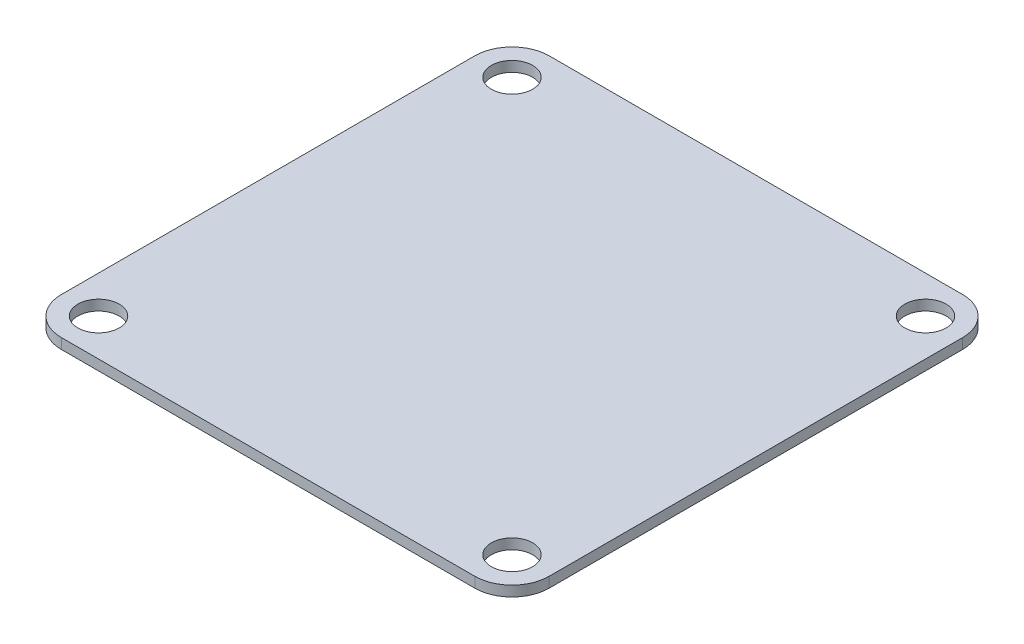
ISO-10303-21;
HEADER;
FILE_DESCRIPTION(('STEP AP214'),'2;1');
FILE_NAME('part.step','',(''),(''),'','','');
FILE_SCHEMA(('AUTOMOTIVE_DESIGN { 1 0 10303 214 1 1 1 1 }'));
ENDSEC;
DATA;
#1=APPLICATION_CONTEXT('core data for automotive mechanical design processes');
#2=APPLICATION_PROTOCOL_DEFINITION('international standard','automotive_design',2000,#1);
#3=PRODUCT_CONTEXT('',#1,'mechanical');
#4=PRODUCT('Part','Part','',(#3));
#5=PRODUCT_RELATED_PRODUCT_CATEGORY('part','',(#4));
#6=PRODUCT_DEFINITION_FORMATION('','',#4);
#7=PRODUCT_DEFINITION_CONTEXT('part definition',#1,'design');
#8=PRODUCT_DEFINITION('design','',#6,#7);
#9=PRODUCT_DEFINITION_SHAPE('','',#8);
#10=(LENGTH_UNIT() NAMED_UNIT(*) SI_UNIT(.MILLI.,.METRE.));
#11=(NAMED_UNIT(*) PLANE_ANGLE_UNIT() SI_UNIT($,.RADIAN.));
#12=(NAMED_UNIT(*) SI_UNIT($,.STERADIAN.) SOLID_ANGLE_UNIT());
#13=UNCERTAINTY_MEASURE_WITH_UNIT(LENGTH_MEASURE(1.E-05),#10,'distance_accuracy_value','');
#14=(GEOMETRIC_REPRESENTATION_CONTEXT(3) GLOBAL_UNCERTAINTY_ASSIGNED_CONTEXT((#13)) GLOBAL_UNIT_ASSIGNED_CONTEXT((#10,
#11,#12)) REPRESENTATION_CONTEXT('',''));
#15=CARTESIAN_POINT('',(0.,0.,0.));
#16=DIRECTION('',(0.,0.,1.));
#17=DIRECTION('',(1.,0.,0.));
#18=AXIS2_PLACEMENT_3D('',#15,#16,#17);
#19=CARTESIAN_POINT('',(-99.9999999999941,5.,-99.9999999999964));
#20=DIRECTION('',(0.,1.,0.));
#21=DIRECTION('',(0.,0.,1.));
#22=AXIS2_PLACEMENT_3D('',#19,#20,#21);
#23=PLANE('',#22);
#24=CARTESIAN_POINT('',(-99.9999999999905,5.,99.9999999999976));
#25=DIRECTION('',(0.,1.,0.));
#26=DIRECTION('',(0.,0.,1.));
#27=AXIS2_PLACEMENT_3D('',#24,#25,#26);
#28=CIRCLE('',#27,10.0000000000102);
#29=CARTESIAN_POINT('',(-99.9999999999905,5.,110.000000000008));
#30=VERTEX_POINT('',#29);
#31=EDGE_CURVE('E188',#30,#30,#28,.T.);
#32=ORIENTED_EDGE('',*,*,#31,.F.);
#33=EDGE_LOOP('',(#32));
#34=FACE_BOUND('',#33,.T.);
#35=CARTESIAN_POINT('',(100.,5.,-100.));
#36=DIRECTION('',(0.,1.,0.));
#37=DIRECTION('',(0.,0.,1.));
#38=AXIS2_PLACEMENT_3D('',#35,#36,#37);
#39=CIRCLE('',#38,9.99999999999999);
#40=CARTESIAN_POINT('',(100.,5.,-90.));
#41=VERTEX_POINT('',#40);
#42=EDGE_CURVE('E134',#41,#41,#39,.T.);
#43=ORIENTED_EDGE('',*,*,#42,.F.);
#44=EDGE_LOOP('',(#43));
#45=FACE_BOUND('',#44,.T.);
#46=CARTESIAN_POINT('',(-99.9999999999941,5.,-99.9999999999964));
#47=DIRECTION('',(0.,1.,0.));
#48=DIRECTION('',(0.,0.,1.));
#49=AXIS2_PLACEMENT_3D('',#46,#47,#48);
#50=CIRCLE('',#49,18.);
#51=CARTESIAN_POINT('',(-99.9999999999941,5.,-117.999999999996));
#52=VERTEX_POINT('',#51);
#53=CARTESIAN_POINT('',(-117.999999999994,5.,-99.9999999999964));
#54=VERTEX_POINT('',#53);
#55=EDGE_CURVE('E145',#52,#54,#50,.T.);
#56=ORIENTED_EDGE('',*,*,#55,.T.);
#57=DIRECTION('',(0.,0.,1.));
#58=VECTOR('',#57,1.);
#59=CARTESIAN_POINT('',(-117.999999999994,5.,99.9999999999983));
#60=LINE('',#59,#58);
#61=CARTESIAN_POINT('',(-117.999999999994,5.,99.9999999999983));
#62=VERTEX_POINT('',#61);
#63=EDGE_CURVE('E93',#54,#62,#60,.T.);
#64=ORIENTED_EDGE('',*,*,#63,.T.);
#65=CARTESIAN_POINT('',(-99.999999999994,5.,99.9999999999983));
#66=DIRECTION('',(0.,1.,0.));
#67=DIRECTION('',(0.,0.,1.));
#68=AXIS2_PLACEMENT_3D('',#65,#66,#67);
#69=CIRCLE('',#68,18.);
#70=CARTESIAN_POINT('',(-99.9999999999941,5.,117.999999999998));
#71=VERTEX_POINT('',#70);
#72=EDGE_CURVE('E160',#62,#71,#69,.T.);
#73=ORIENTED_EDGE('',*,*,#72,.T.);
#74=DIRECTION('',(1.,0.,0.));
#75=VECTOR('',#74,1.);
#76=CARTESIAN_POINT('',(100.000000000001,5.,117.999999999998));
#77=LINE('',#76,#75);
#78=CARTESIAN_POINT('',(100.000000000001,5.,117.999999999998));
#79=VERTEX_POINT('',#78);
#80=EDGE_CURVE('E173',#71,#79,#77,.T.);
#81=ORIENTED_EDGE('',*,*,#80,.T.);
#82=CARTESIAN_POINT('',(100.000000000001,5.,99.9999999999983));
#83=DIRECTION('',(0.,1.,0.));
#84=DIRECTION('',(0.,0.,1.));
#85=AXIS2_PLACEMENT_3D('',#82,#83,#84);
#86=CIRCLE('',#85,18.);
#87=CARTESIAN_POINT('',(118.000000000001,5.,99.9999999999983));
#88=VERTEX_POINT('',#87);
#89=EDGE_CURVE('E112',#79,#88,#86,.T.);
#90=ORIENTED_EDGE('',*,*,#89,.T.);
#91=DIRECTION('',(0.,0.,-1.));
#92=VECTOR('',#91,1.);
#93=CARTESIAN_POINT('',(118.000000000001,5.,-99.9999999999964));
#94=LINE('',#93,#92);
#95=CARTESIAN_POINT('',(118.000000000001,5.,-99.9999999999964));
#96=VERTEX_POINT('',#95);
#97=EDGE_CURVE('E106',#88,#96,#94,.T.);
#98=ORIENTED_EDGE('',*,*,#97,.T.);
#99=CARTESIAN_POINT('',(100.000000000001,5.,-99.9999999999964));
#100=DIRECTION('',(0.,1.,0.));
#101=DIRECTION('',(0.,0.,1.));
#102=AXIS2_PLACEMENT_3D('',#99,#100,#101);
#103=CIRCLE('',#102,18.);
#104=CARTESIAN_POINT('',(100.000000000001,5.,-117.999999999996));
#105=VERTEX_POINT('',#104);
#106=EDGE_CURVE('E110',#96,#105,#103,.T.);
#107=ORIENTED_EDGE('',*,*,#106,.T.);
#108=DIRECTION('',(-1.,0.,0.));
#109=VECTOR('',#108,1.);
#110=CARTESIAN_POINT('',(-99.9999999999941,5.,-117.999999999996));
#111=LINE('',#110,#109);
#112=EDGE_CURVE('E50',#105,#52,#111,.T.);
#113=ORIENTED_EDGE('',*,*,#112,.T.);
#114=EDGE_LOOP('',(#56,#64,#73,#81,#90,#98,#107,#113));
#115=FACE_BOUND('',#114,.T.);
#116=CARTESIAN_POINT('',(100.000000000004,5.,99.999999999994));
#117=DIRECTION('',(0.,1.,0.));
#118=DIRECTION('',(0.,0.,1.));
#119=AXIS2_PLACEMENT_3D('',#116,#117,#118);
#120=CIRCLE('',#119,10.0000000000049);
#121=CARTESIAN_POINT('',(100.000000000004,5.,109.999999999999));
#122=VERTEX_POINT('',#121);
#123=EDGE_CURVE('E182',#122,#122,#120,.T.);
#124=ORIENTED_EDGE('',*,*,#123,.F.);
#125=EDGE_LOOP('',(#124));
#126=FACE_BOUND('',#125,.T.);
#127=CARTESIAN_POINT('',(-99.9999999999941,5.,-99.9999999999964));
#128=DIRECTION('',(0.,1.,0.));
#129=DIRECTION('',(0.,0.,1.));
#130=AXIS2_PLACEMENT_3D('',#127,#128,#129);
#131=CIRCLE('',#130,10.0000000000058);
#132=CARTESIAN_POINT('',(-99.9999999999941,5.,-89.9999999999906));
#133=VERTEX_POINT('',#132);
#134=EDGE_CURVE('E194',#133,#133,#131,.T.);
#135=ORIENTED_EDGE('',*,*,#134,.F.);
#136=EDGE_LOOP('',(#135));
#137=FACE_BOUND('',#136,.T.);
#138=ADVANCED_FACE('F33',(#34,#45,#115,#126,#137),#23,.T.);
#139=CARTESIAN_POINT('',(-99.9999999999941,0.,-99.9999999999964));
#140=DIRECTION('',(0.,1.,0.));
#141=DIRECTION('',(0.,0.,1.));
#142=AXIS2_PLACEMENT_3D('',#139,#140,#141);
#143=PLANE('',#142);
#144=CARTESIAN_POINT('',(-99.9999999999941,0.,-99.9999999999964));
#145=DIRECTION('',(0.,1.,0.));
#146=DIRECTION('',(0.,0.,1.));
#147=AXIS2_PLACEMENT_3D('',#144,#145,#146);
#148=CIRCLE('',#147,18.);
#149=CARTESIAN_POINT('',(-99.9999999999941,0.,-117.999999999996));
#150=VERTEX_POINT('',#149);
#151=CARTESIAN_POINT('',(-117.999999999994,0.,-99.9999999999964));
#152=VERTEX_POINT('',#151);
#153=EDGE_CURVE('E130',#150,#152,#148,.T.);
#154=ORIENTED_EDGE('',*,*,#153,.F.);
#155=DIRECTION('',(-1.,0.,0.));
#156=VECTOR('',#155,1.);
#157=CARTESIAN_POINT('',(-99.9999999999941,0.,-117.999999999996));
#158=LINE('',#157,#156);
#159=CARTESIAN_POINT('',(100.000000000001,0.,-117.999999999996));
#160=VERTEX_POINT('',#159);
#161=EDGE_CURVE('E85',#160,#150,#158,.T.);
#162=ORIENTED_EDGE('',*,*,#161,.F.);
#163=CARTESIAN_POINT('',(100.000000000001,0.,-99.9999999999964));
#164=DIRECTION('',(0.,1.,0.));
#165=DIRECTION('',(0.,0.,1.));
#166=AXIS2_PLACEMENT_3D('',#163,#164,#165);
#167=CIRCLE('',#166,18.);
#168=CARTESIAN_POINT('',(118.000000000001,0.,-99.9999999999964));
#169=VERTEX_POINT('',#168);
#170=EDGE_CURVE('E79',#169,#160,#167,.T.);
#171=ORIENTED_EDGE('',*,*,#170,.F.);
#172=DIRECTION('',(0.,0.,-1.));
#173=VECTOR('',#172,1.);
#174=CARTESIAN_POINT('',(118.000000000001,0.,-99.9999999999964));
#175=LINE('',#174,#173);
#176=CARTESIAN_POINT('',(118.000000000001,0.,99.9999999999983));
#177=VERTEX_POINT('',#176);
#178=EDGE_CURVE('E120',#177,#169,#175,.T.);
#179=ORIENTED_EDGE('',*,*,#178,.F.);
#180=CARTESIAN_POINT('',(100.000000000001,0.,99.9999999999983));
#181=DIRECTION('',(0.,1.,0.));
#182=DIRECTION('',(0.,0.,1.));
#183=AXIS2_PLACEMENT_3D('',#180,#181,#182);
#184=CIRCLE('',#183,18.);
#185=CARTESIAN_POINT('',(100.000000000001,0.,117.999999999998));
#186=VERTEX_POINT('',#185);
#187=EDGE_CURVE('E140',#186,#177,#184,.T.);
#188=ORIENTED_EDGE('',*,*,#187,.F.);
#189=DIRECTION('',(1.,0.,0.));
#190=VECTOR('',#189,1.);
#191=CARTESIAN_POINT('',(100.000000000001,0.,117.999999999998));
#192=LINE('',#191,#190);
#193=CARTESIAN_POINT('',(-99.9999999999941,0.,117.999999999998));
#194=VERTEX_POINT('',#193);
#195=EDGE_CURVE('E138',#194,#186,#192,.T.);
#196=ORIENTED_EDGE('',*,*,#195,.F.);
#197=CARTESIAN_POINT('',(-99.999999999994,0.,99.9999999999983));
#198=DIRECTION('',(0.,1.,0.));
#199=DIRECTION('',(0.,0.,1.));
#200=AXIS2_PLACEMENT_3D('',#197,#198,#199);
#201=CIRCLE('',#200,18.);
#202=CARTESIAN_POINT('',(-117.999999999994,0.,99.9999999999983));
#203=VERTEX_POINT('',#202);
#204=EDGE_CURVE('E136',#203,#194,#201,.T.);
#205=ORIENTED_EDGE('',*,*,#204,.F.);
#206=DIRECTION('',(0.,0.,1.));
#207=VECTOR('',#206,1.);
#208=CARTESIAN_POINT('',(-117.999999999994,0.,99.9999999999983));
#209=LINE('',#208,#207);
#210=EDGE_CURVE('E133',#152,#203,#209,.T.);
#211=ORIENTED_EDGE('',*,*,#210,.F.);
#212=EDGE_LOOP('',(#154,#162,#171,#179,#188,#196,#205,#211));
#213=FACE_BOUND('',#212,.T.);
#214=CARTESIAN_POINT('',(100.,0.,-100.));
#215=DIRECTION('',(0.,1.,0.));
#216=DIRECTION('',(0.,0.,1.));
#217=AXIS2_PLACEMENT_3D('',#214,#215,#216);
#218=CIRCLE('',#217,9.99999999999999);
#219=CARTESIAN_POINT('',(100.,0.,-90.));
#220=VERTEX_POINT('',#219);
#221=EDGE_CURVE('E179',#220,#220,#218,.T.);
#222=ORIENTED_EDGE('',*,*,#221,.T.);
#223=EDGE_LOOP('',(#222));
#224=FACE_BOUND('',#223,.T.);
#225=CARTESIAN_POINT('',(100.000000000004,0.,99.999999999994));
#226=DIRECTION('',(0.,1.,0.));
#227=DIRECTION('',(0.,0.,1.));
#228=AXIS2_PLACEMENT_3D('',#225,#226,#227);
#229=CIRCLE('',#228,10.0000000000049);
#230=CARTESIAN_POINT('',(100.000000000004,0.,109.999999999999));
#231=VERTEX_POINT('',#230);
#232=EDGE_CURVE('E185',#231,#231,#229,.T.);
#233=ORIENTED_EDGE('',*,*,#232,.T.);
#234=EDGE_LOOP('',(#233));
#235=FACE_BOUND('',#234,.T.);
#236=CARTESIAN_POINT('',(-99.9999999999905,0.,99.9999999999976));
#237=DIRECTION('',(0.,1.,0.));
#238=DIRECTION('',(0.,0.,1.));
#239=AXIS2_PLACEMENT_3D('',#236,#237,#238);
#240=CIRCLE('',#239,10.0000000000102);
#241=CARTESIAN_POINT('',(-99.9999999999905,0.,110.000000000008));
#242=VERTEX_POINT('',#241);
#243=EDGE_CURVE('E191',#242,#242,#240,.T.);
#244=ORIENTED_EDGE('',*,*,#243,.T.);
#245=EDGE_LOOP('',(#244));
#246=FACE_BOUND('',#245,.T.);
#247=CARTESIAN_POINT('',(-99.9999999999941,0.,-99.9999999999964));
#248=DIRECTION('',(0.,1.,0.));
#249=DIRECTION('',(0.,0.,1.));
#250=AXIS2_PLACEMENT_3D('',#247,#248,#249);
#251=CIRCLE('',#250,10.0000000000058);
#252=CARTESIAN_POINT('',(-99.9999999999941,0.,-89.9999999999906));
#253=VERTEX_POINT('',#252);
#254=EDGE_CURVE('E197',#253,#253,#251,.T.);
#255=ORIENTED_EDGE('',*,*,#254,.T.);
#256=EDGE_LOOP('',(#255));
#257=FACE_BOUND('',#256,.T.);
#258=ADVANCED_FACE('F164',(#213,#224,#235,#246,#257),#143,.F.);
#259=CARTESIAN_POINT('',(-99.9999999999941,5.,-99.9999999999964));
#260=DIRECTION('',(0.,-1.,0.));
#261=DIRECTION('',(0.,0.,-1.));
#262=AXIS2_PLACEMENT_3D('',#259,#260,#261);
#263=CYLINDRICAL_SURFACE('',#262,18.);
#264=ORIENTED_EDGE('',*,*,#153,.T.);
#265=DIRECTION('',(0.,-1.,0.));
#266=VECTOR('',#265,1.);
#267=CARTESIAN_POINT('',(-117.999999999994,5.,-99.9999999999964));
#268=LINE('',#267,#266);
#269=EDGE_CURVE('E11',#54,#152,#268,.T.);
#270=ORIENTED_EDGE('',*,*,#269,.F.);
#271=ORIENTED_EDGE('',*,*,#55,.F.);
#272=DIRECTION('',(0.,-1.,0.));
#273=VECTOR('',#272,1.);
#274=CARTESIAN_POINT('',(-99.9999999999941,5.,-117.999999999996));
#275=LINE('',#274,#273);
#276=EDGE_CURVE('E126',#52,#150,#275,.T.);
#277=ORIENTED_EDGE('',*,*,#276,.T.);
#278=EDGE_LOOP('',(#264,#270,#271,#277));
#279=FACE_BOUND('',#278,.T.);
#280=ADVANCED_FACE('F35',(#279),#263,.T.);
#281=CARTESIAN_POINT('',(-117.999999999994,5.,99.9999999999983));
#282=DIRECTION('',(1.,0.,0.));
#283=DIRECTION('',(0.,0.,-1.));
#284=AXIS2_PLACEMENT_3D('',#281,#282,#283);
#285=PLANE('',#284);
#286=ORIENTED_EDGE('',*,*,#210,.T.);
#287=DIRECTION('',(0.,-1.,0.));
#288=VECTOR('',#287,1.);
#289=CARTESIAN_POINT('',(-117.999999999994,5.,99.9999999999983));
#290=LINE('',#289,#288);
#291=EDGE_CURVE('E42',#62,#203,#290,.T.);
#292=ORIENTED_EDGE('',*,*,#291,.F.);
#293=ORIENTED_EDGE('',*,*,#63,.F.);
#294=ORIENTED_EDGE('',*,*,#269,.T.);
#295=EDGE_LOOP('',(#286,#292,#293,#294));
#296=FACE_BOUND('',#295,.T.);
#297=ADVANCED_FACE('F231',(#296),#285,.F.);
#298=CARTESIAN_POINT('',(-99.999999999994,5.,99.9999999999983));
#299=DIRECTION('',(0.,-1.,0.));
#300=DIRECTION('',(0.,0.,-1.));
#301=AXIS2_PLACEMENT_3D('',#298,#299,#300);
#302=CYLINDRICAL_SURFACE('',#301,18.);
#303=ORIENTED_EDGE('',*,*,#204,.T.);
#304=DIRECTION('',(0.,-1.,0.));
#305=VECTOR('',#304,1.);
#306=CARTESIAN_POINT('',(-99.9999999999941,5.,117.999999999998));
#307=LINE('',#306,#305);
#308=EDGE_CURVE('E152',#71,#194,#307,.T.);
#309=ORIENTED_EDGE('',*,*,#308,.F.);
#310=ORIENTED_EDGE('',*,*,#72,.F.);
#311=ORIENTED_EDGE('',*,*,#291,.T.);
#312=EDGE_LOOP('',(#303,#309,#310,#311));
#313=FACE_BOUND('',#312,.T.);
#314=ADVANCED_FACE('F158',(#313),#302,.T.);
#315=CARTESIAN_POINT('',(100.000000000001,5.,117.999999999998));
#316=DIRECTION('',(0.,0.,-1.));
#317=DIRECTION('',(-1.,0.,0.));
#318=AXIS2_PLACEMENT_3D('',#315,#316,#317);
#319=PLANE('',#318);
#320=ORIENTED_EDGE('',*,*,#195,.T.);
#321=DIRECTION('',(0.,-1.,0.));
#322=VECTOR('',#321,1.);
#323=CARTESIAN_POINT('',(100.000000000001,5.,117.999999999998));
#324=LINE('',#323,#322);
#325=EDGE_CURVE('E149',#79,#186,#324,.T.);
#326=ORIENTED_EDGE('',*,*,#325,.F.);
#327=ORIENTED_EDGE('',*,*,#80,.F.);
#328=ORIENTED_EDGE('',*,*,#308,.T.);
#329=EDGE_LOOP('',(#320,#326,#327,#328));
#330=FACE_BOUND('',#329,.T.);
#331=ADVANCED_FACE('F169',(#330),#319,.F.);
#332=CARTESIAN_POINT('',(100.000000000001,5.,99.9999999999983));
#333=DIRECTION('',(0.,-1.,0.));
#334=DIRECTION('',(0.,0.,-1.));
#335=AXIS2_PLACEMENT_3D('',#332,#333,#334);
#336=CYLINDRICAL_SURFACE('',#335,18.);
#337=ORIENTED_EDGE('',*,*,#187,.T.);
#338=DIRECTION('',(0.,-1.,0.));
#339=VECTOR('',#338,1.);
#340=CARTESIAN_POINT('',(118.000000000001,5.,99.9999999999983));
#341=LINE('',#340,#339);
#342=EDGE_CURVE('E121',#88,#177,#341,.T.);
#343=ORIENTED_EDGE('',*,*,#342,.F.);
#344=ORIENTED_EDGE('',*,*,#89,.F.);
#345=ORIENTED_EDGE('',*,*,#325,.T.);
#346=EDGE_LOOP('',(#337,#343,#344,#345));
#347=FACE_BOUND('',#346,.T.);
#348=ADVANCED_FACE('F172',(#347),#336,.T.);
#349=CARTESIAN_POINT('',(118.000000000001,5.,-99.9999999999964));
#350=DIRECTION('',(-1.,0.,0.));
#351=DIRECTION('',(0.,0.,1.));
#352=AXIS2_PLACEMENT_3D('',#349,#350,#351);
#353=PLANE('',#352);
#354=ORIENTED_EDGE('',*,*,#178,.T.);
#355=DIRECTION('',(0.,-1.,0.));
#356=VECTOR('',#355,1.);
#357=CARTESIAN_POINT('',(118.000000000001,5.,-99.9999999999964));
#358=LINE('',#357,#356);
#359=EDGE_CURVE('E117',#96,#169,#358,.T.);
#360=ORIENTED_EDGE('',*,*,#359,.F.);
#361=ORIENTED_EDGE('',*,*,#97,.F.);
#362=ORIENTED_EDGE('',*,*,#342,.T.);
#363=EDGE_LOOP('',(#354,#360,#361,#362));
#364=FACE_BOUND('',#363,.T.);
#365=ADVANCED_FACE('F118',(#364),#353,.F.);
#366=CARTESIAN_POINT('',(100.000000000001,5.,-99.9999999999964));
#367=DIRECTION('',(0.,-1.,0.));
#368=DIRECTION('',(0.,0.,-1.));
#369=AXIS2_PLACEMENT_3D('',#366,#367,#368);
#370=CYLINDRICAL_SURFACE('',#369,18.);
#371=ORIENTED_EDGE('',*,*,#170,.T.);
#372=DIRECTION('',(0.,-1.,0.));
#373=VECTOR('',#372,1.);
#374=CARTESIAN_POINT('',(100.000000000001,5.,-117.999999999996));
#375=LINE('',#374,#373);
#376=EDGE_CURVE('E122',#105,#160,#375,.T.);
#377=ORIENTED_EDGE('',*,*,#376,.F.);
#378=ORIENTED_EDGE('',*,*,#106,.F.);
#379=ORIENTED_EDGE('',*,*,#359,.T.);
#380=EDGE_LOOP('',(#371,#377,#378,#379));
#381=FACE_BOUND('',#380,.T.);
#382=ADVANCED_FACE('F124',(#381),#370,.T.);
#383=CARTESIAN_POINT('',(-99.9999999999941,5.,-117.999999999996));
#384=DIRECTION('',(0.,0.,1.));
#385=DIRECTION('',(1.,0.,0.));
#386=AXIS2_PLACEMENT_3D('',#383,#384,#385);
#387=PLANE('',#386);
#388=ORIENTED_EDGE('',*,*,#161,.T.);
#389=ORIENTED_EDGE('',*,*,#276,.F.);
#390=ORIENTED_EDGE('',*,*,#112,.F.);
#391=ORIENTED_EDGE('',*,*,#376,.T.);
#392=EDGE_LOOP('',(#388,#389,#390,#391));
#393=FACE_BOUND('',#392,.T.);
#394=ADVANCED_FACE('F219',(#393),#387,.F.);
#395=CARTESIAN_POINT('',(100.,5.,-100.));
#396=DIRECTION('',(0.,-1.,0.));
#397=DIRECTION('',(0.,0.,-1.));
#398=AXIS2_PLACEMENT_3D('',#395,#396,#397);
#399=CYLINDRICAL_SURFACE('',#398,9.99999999999999);
#400=ORIENTED_EDGE('',*,*,#42,.T.);
#401=EDGE_LOOP('',(#400));
#402=FACE_BOUND('',#401,.T.);
#403=ORIENTED_EDGE('',*,*,#221,.F.);
#404=EDGE_LOOP('',(#403));
#405=FACE_BOUND('',#404,.T.);
#406=ADVANCED_FACE('F216',(#402,#405),#399,.F.);
#407=CARTESIAN_POINT('',(100.000000000004,5.,99.999999999994));
#408=DIRECTION('',(0.,-1.,0.));
#409=DIRECTION('',(0.,0.,-1.));
#410=AXIS2_PLACEMENT_3D('',#407,#408,#409);
#411=CYLINDRICAL_SURFACE('',#410,10.0000000000049);
#412=ORIENTED_EDGE('',*,*,#123,.T.);
#413=EDGE_LOOP('',(#412));
#414=FACE_BOUND('',#413,.T.);
#415=ORIENTED_EDGE('',*,*,#232,.F.);
#416=EDGE_LOOP('',(#415));
#417=FACE_BOUND('',#416,.T.);
#418=ADVANCED_FACE('F295',(#414,#417),#411,.F.);
#419=CARTESIAN_POINT('',(-99.9999999999905,5.,99.9999999999976));
#420=DIRECTION('',(0.,-1.,0.));
#421=DIRECTION('',(0.,0.,-1.));
#422=AXIS2_PLACEMENT_3D('',#419,#420,#421);
#423=CYLINDRICAL_SURFACE('',#422,10.0000000000102);
#424=ORIENTED_EDGE('',*,*,#31,.T.);
#425=EDGE_LOOP('',(#424));
#426=FACE_BOUND('',#425,.T.);
#427=ORIENTED_EDGE('',*,*,#243,.F.);
#428=EDGE_LOOP('',(#427));
#429=FACE_BOUND('',#428,.T.);
#430=ADVANCED_FACE('F303',(#426,#429),#423,.F.);
#431=CARTESIAN_POINT('',(-99.9999999999941,5.,-99.9999999999964));
#432=DIRECTION('',(0.,-1.,0.));
#433=DIRECTION('',(0.,0.,-1.));
#434=AXIS2_PLACEMENT_3D('',#431,#432,#433);
#435=CYLINDRICAL_SURFACE('',#434,10.0000000000058);
#436=ORIENTED_EDGE('',*,*,#134,.T.);
#437=EDGE_LOOP('',(#436));
#438=FACE_BOUND('',#437,.T.);
#439=ORIENTED_EDGE('',*,*,#254,.F.);
#440=EDGE_LOOP('',(#439));
#441=FACE_BOUND('',#440,.T.);
#442=ADVANCED_FACE('F203',(#438,#441),#435,.F.);
#443=CLOSED_SHELL('',(#138,#258,#280,#297,#314,#331,#348,#365,#382,#394,#406,#418,#430,#442));
#444=MANIFOLD_SOLID_BREP('B2',#443);
#445=ADVANCED_BREP_SHAPE_REPRESENTATION('',(#18,#444),#14);
#446=SHAPE_DEFINITION_REPRESENTATION(#9,#445);
ENDSEC;
END-ISO-10303-21;
